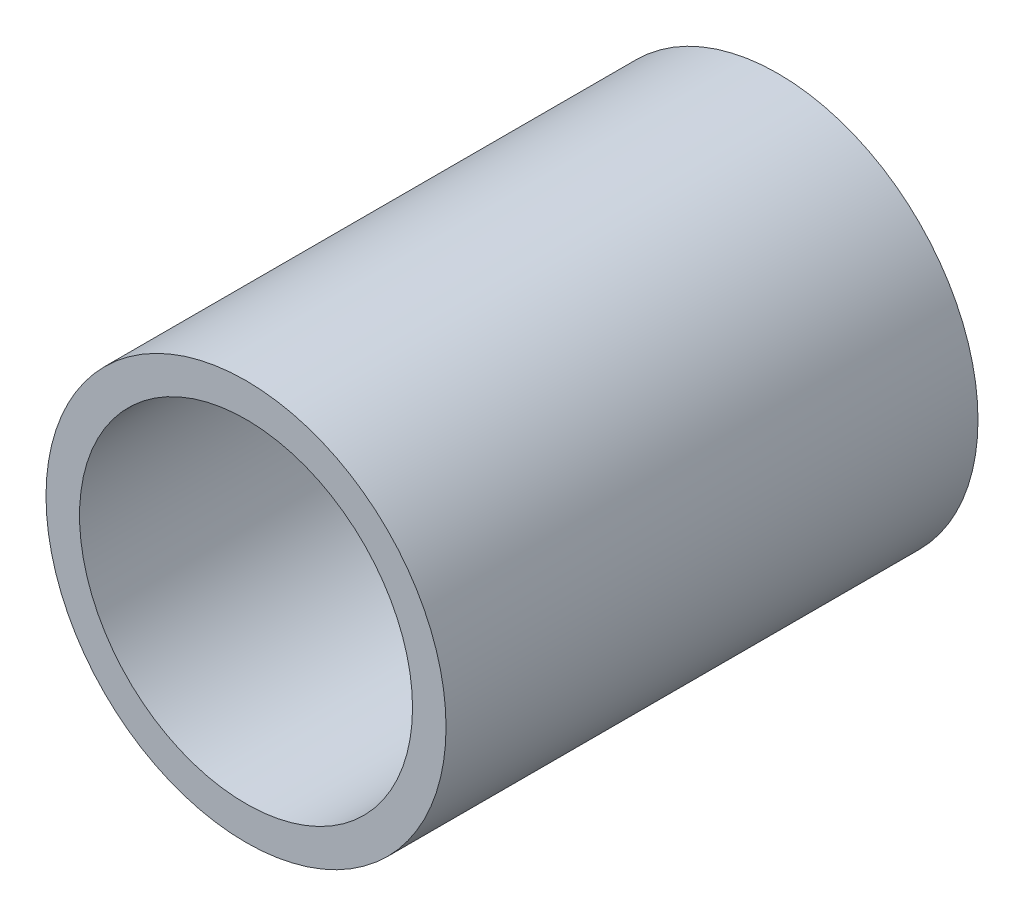
ISO-10303-21;
HEADER;
FILE_DESCRIPTION(('STEP AP214'),'2;1');
FILE_NAME('part.step','',(''),(''),'','','');
FILE_SCHEMA(('AUTOMOTIVE_DESIGN { 1 0 10303 214 1 1 1 1 }'));
ENDSEC;
DATA;
#1=APPLICATION_CONTEXT('core data for automotive mechanical design processes');
#2=APPLICATION_PROTOCOL_DEFINITION('international standard','automotive_design',2000,#1);
#3=PRODUCT_CONTEXT('',#1,'mechanical');
#4=PRODUCT('Part','Part','',(#3));
#5=PRODUCT_RELATED_PRODUCT_CATEGORY('part','',(#4));
#6=PRODUCT_DEFINITION_FORMATION('','',#4);
#7=PRODUCT_DEFINITION_CONTEXT('part definition',#1,'design');
#8=PRODUCT_DEFINITION('design','',#6,#7);
#9=PRODUCT_DEFINITION_SHAPE('','',#8);
#10=(LENGTH_UNIT() NAMED_UNIT(*) SI_UNIT(.MILLI.,.METRE.));
#11=(NAMED_UNIT(*) PLANE_ANGLE_UNIT() SI_UNIT($,.RADIAN.));
#12=(NAMED_UNIT(*) SI_UNIT($,.STERADIAN.) SOLID_ANGLE_UNIT());
#13=UNCERTAINTY_MEASURE_WITH_UNIT(LENGTH_MEASURE(1.E-05),#10,'distance_accuracy_value','');
#14=(GEOMETRIC_REPRESENTATION_CONTEXT(3) GLOBAL_UNCERTAINTY_ASSIGNED_CONTEXT((#13)) GLOBAL_UNIT_ASSIGNED_CONTEXT((#10,
#11,#12)) REPRESENTATION_CONTEXT('',''));
#15=CARTESIAN_POINT('',(0.,0.,0.));
#16=DIRECTION('',(0.,0.,1.));
#17=DIRECTION('',(1.,0.,0.));
#18=AXIS2_PLACEMENT_3D('',#15,#16,#17);
#19=CARTESIAN_POINT('',(0.,0.,12.7));
#20=DIRECTION('',(0.,0.,1.));
#21=DIRECTION('',(1.,0.,0.));
#22=AXIS2_PLACEMENT_3D('',#19,#20,#21);
#23=PLANE('',#22);
#24=CARTESIAN_POINT('',(0.,0.,12.7));
#25=DIRECTION('',(0.,0.,1.));
#26=DIRECTION('',(1.,0.,0.));
#27=AXIS2_PLACEMENT_3D('',#24,#25,#26);
#28=CIRCLE('',#27,9.5504);
#29=CARTESIAN_POINT('',(9.5504,0.,12.7));
#30=VERTEX_POINT('',#29);
#31=EDGE_CURVE('E10',#30,#30,#28,.T.);
#32=ORIENTED_EDGE('',*,*,#31,.T.);
#33=EDGE_LOOP('',(#32));
#34=FACE_BOUND('',#33,.T.);
#35=CARTESIAN_POINT('',(0.,0.,12.7));
#36=DIRECTION('',(0.,0.,1.));
#37=DIRECTION('',(1.,0.,0.));
#38=AXIS2_PLACEMENT_3D('',#35,#36,#37);
#39=CIRCLE('',#38,7.9502);
#40=CARTESIAN_POINT('',(7.9502,0.,12.7));
#41=VERTEX_POINT('',#40);
#42=EDGE_CURVE('E39',#41,#41,#39,.T.);
#43=ORIENTED_EDGE('',*,*,#42,.F.);
#44=EDGE_LOOP('',(#43));
#45=FACE_BOUND('',#44,.T.);
#46=ADVANCED_FACE('F32',(#34,#45),#23,.T.);
#47=CARTESIAN_POINT('',(0.,0.,12.7));
#48=DIRECTION('',(0.,0.,-1.));
#49=DIRECTION('',(-1.,0.,0.));
#50=AXIS2_PLACEMENT_3D('',#47,#48,#49);
#51=CYLINDRICAL_SURFACE('',#50,9.5504);
#52=ORIENTED_EDGE('',*,*,#31,.F.);
#53=EDGE_LOOP('',(#52));
#54=FACE_BOUND('',#53,.T.);
#55=CARTESIAN_POINT('',(0.,0.,-12.7));
#56=DIRECTION('',(0.,0.,1.));
#57=DIRECTION('',(1.,0.,0.));
#58=AXIS2_PLACEMENT_3D('',#55,#56,#57);
#59=CIRCLE('',#58,9.5504);
#60=CARTESIAN_POINT('',(9.5504,0.,-12.7));
#61=VERTEX_POINT('',#60);
#62=EDGE_CURVE('E43',#61,#61,#59,.T.);
#63=ORIENTED_EDGE('',*,*,#62,.T.);
#64=EDGE_LOOP('',(#63));
#65=FACE_BOUND('',#64,.T.);
#66=ADVANCED_FACE('F34',(#54,#65),#51,.T.);
#67=CARTESIAN_POINT('',(0.,0.,12.7));
#68=DIRECTION('',(0.,0.,-1.));
#69=DIRECTION('',(-1.,0.,0.));
#70=AXIS2_PLACEMENT_3D('',#67,#68,#69);
#71=CYLINDRICAL_SURFACE('',#70,7.9502);
#72=ORIENTED_EDGE('',*,*,#42,.T.);
#73=EDGE_LOOP('',(#72));
#74=FACE_BOUND('',#73,.T.);
#75=CARTESIAN_POINT('',(0.,0.,-12.7));
#76=DIRECTION('',(0.,0.,1.));
#77=DIRECTION('',(1.,0.,0.));
#78=AXIS2_PLACEMENT_3D('',#75,#76,#77);
#79=CIRCLE('',#78,7.9502);
#80=CARTESIAN_POINT('',(7.9502,0.,-12.7));
#81=VERTEX_POINT('',#80);
#82=EDGE_CURVE('E47',#81,#81,#79,.T.);
#83=ORIENTED_EDGE('',*,*,#82,.F.);
#84=EDGE_LOOP('',(#83));
#85=FACE_BOUND('',#84,.T.);
#86=ADVANCED_FACE('F56',(#74,#85),#71,.F.);
#87=CARTESIAN_POINT('',(0.,0.,-12.7));
#88=DIRECTION('',(0.,0.,1.));
#89=DIRECTION('',(1.,0.,0.));
#90=AXIS2_PLACEMENT_3D('',#87,#88,#89);
#91=PLANE('',#90);
#92=ORIENTED_EDGE('',*,*,#82,.T.);
#93=EDGE_LOOP('',(#92));
#94=FACE_BOUND('',#93,.T.);
#95=ORIENTED_EDGE('',*,*,#62,.F.);
#96=EDGE_LOOP('',(#95));
#97=FACE_BOUND('',#96,.T.);
#98=ADVANCED_FACE('F53',(#94,#97),#91,.F.);
#99=CLOSED_SHELL('',(#46,#66,#86,#98));
#100=MANIFOLD_SOLID_BREP('B2',#99);
#101=ADVANCED_BREP_SHAPE_REPRESENTATION('',(#18,#100),#14);
#102=SHAPE_DEFINITION_REPRESENTATION(#9,#101);
ENDSEC;
END-ISO-10303-21;
